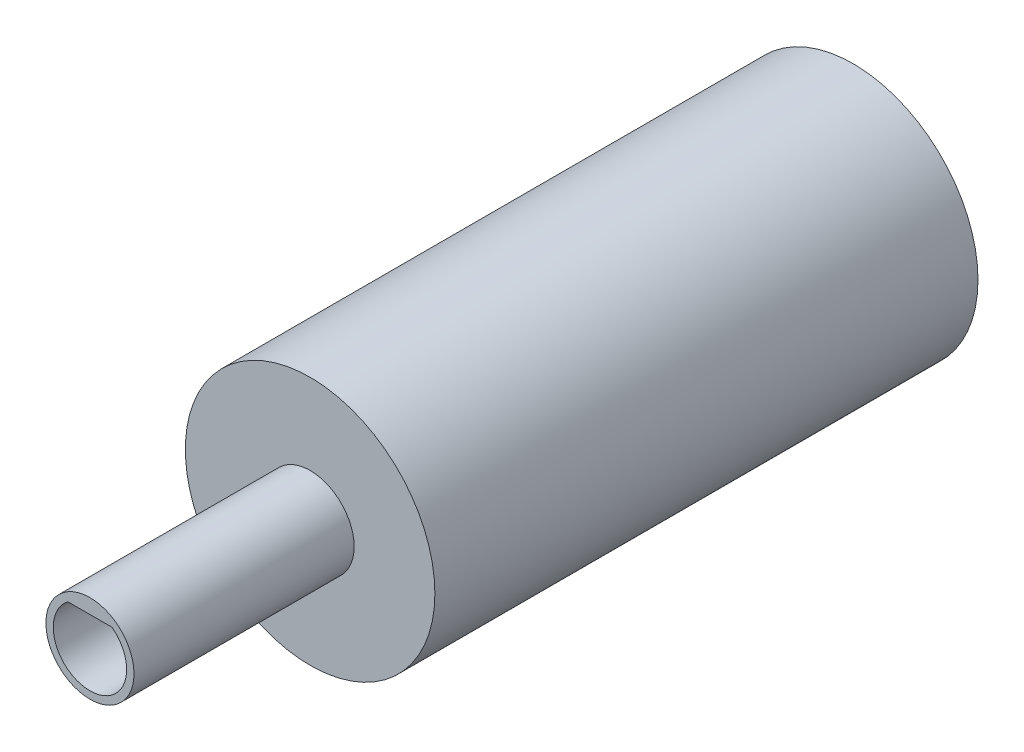
ISO-10303-21;
HEADER;
FILE_DESCRIPTION(('STEP AP214'),'2;1');
FILE_NAME('part.step','',(''),(''),'','','');
FILE_SCHEMA(('AUTOMOTIVE_DESIGN { 1 0 10303 214 1 1 1 1 }'));
ENDSEC;
DATA;
#1=APPLICATION_CONTEXT('core data for automotive mechanical design processes');
#2=APPLICATION_PROTOCOL_DEFINITION('international standard','automotive_design',2000,#1);
#3=PRODUCT_CONTEXT('',#1,'mechanical');
#4=PRODUCT('Part','Part','',(#3));
#5=PRODUCT_RELATED_PRODUCT_CATEGORY('part','',(#4));
#6=PRODUCT_DEFINITION_FORMATION('','',#4);
#7=PRODUCT_DEFINITION_CONTEXT('part definition',#1,'design');
#8=PRODUCT_DEFINITION('design','',#6,#7);
#9=PRODUCT_DEFINITION_SHAPE('','',#8);
#10=(LENGTH_UNIT() NAMED_UNIT(*) SI_UNIT(.MILLI.,.METRE.));
#11=(NAMED_UNIT(*) PLANE_ANGLE_UNIT() SI_UNIT($,.RADIAN.));
#12=(NAMED_UNIT(*) SI_UNIT($,.STERADIAN.) SOLID_ANGLE_UNIT());
#13=UNCERTAINTY_MEASURE_WITH_UNIT(LENGTH_MEASURE(1.E-05),#10,'distance_accuracy_value','');
#14=(GEOMETRIC_REPRESENTATION_CONTEXT(3) GLOBAL_UNCERTAINTY_ASSIGNED_CONTEXT((#13)) GLOBAL_UNIT_ASSIGNED_CONTEXT((#10,
#11,#12)) REPRESENTATION_CONTEXT('',''));
#15=CARTESIAN_POINT('',(0.,0.,0.));
#16=DIRECTION('',(0.,0.,1.));
#17=DIRECTION('',(1.,0.,0.));
#18=AXIS2_PLACEMENT_3D('',#15,#16,#17);
#19=CARTESIAN_POINT('',(0.,4.76175673143294,-5.25));
#20=DIRECTION('',(0.,-1.,0.));
#21=DIRECTION('',(0.,0.,-1.));
#22=AXIS2_PLACEMENT_3D('',#19,#20,#21);
#23=PLANE('',#22);
#24=DIRECTION('',(0.,0.,-1.));
#25=VECTOR('',#24,1.);
#26=CARTESIAN_POINT('',(-2.39,4.76175673143294,-5.25));
#27=LINE('',#26,#25);
#28=CARTESIAN_POINT('',(-2.39,4.76175673143294,-5.25));
#29=VERTEX_POINT('',#28);
#30=CARTESIAN_POINT('',(-2.39,4.76175673143294,-34.61));
#31=VERTEX_POINT('',#30);
#32=EDGE_CURVE('E124',#29,#31,#27,.T.);
#33=ORIENTED_EDGE('',*,*,#32,.T.);
#34=CARTESIAN_POINT('',(0.,4.76175673143294,-34.61));
#35=DIRECTION('',(0.,-1.,0.));
#36=DIRECTION('',(0.,0.,-1.));
#37=AXIS2_PLACEMENT_3D('',#34,#35,#36);
#38=CIRCLE('',#37,2.39);
#39=CARTESIAN_POINT('',(2.39,4.76175673143294,-34.61));
#40=VERTEX_POINT('',#39);
#41=EDGE_CURVE('E107',#31,#40,#38,.T.);
#42=ORIENTED_EDGE('',*,*,#41,.T.);
#43=DIRECTION('',(0.,0.,-1.));
#44=VECTOR('',#43,1.);
#45=CARTESIAN_POINT('',(2.39,4.76175673143294,-5.25));
#46=LINE('',#45,#44);
#47=CARTESIAN_POINT('',(2.39,4.76175673143294,-5.25));
#48=VERTEX_POINT('',#47);
#49=EDGE_CURVE('E132',#48,#40,#46,.T.);
#50=ORIENTED_EDGE('',*,*,#49,.F.);
#51=DIRECTION('',(-1.,0.,0.));
#52=VECTOR('',#51,1.);
#53=CARTESIAN_POINT('',(0.,4.76175673143294,-5.25));
#54=LINE('',#53,#52);
#55=EDGE_CURVE('E131',#48,#29,#54,.T.);
#56=ORIENTED_EDGE('',*,*,#55,.T.);
#57=EDGE_LOOP('',(#33,#42,#50,#56));
#58=FACE_BOUND('',#57,.T.);
#59=ADVANCED_FACE('F52',(#58),#23,.T.);
#60=CARTESIAN_POINT('',(-2.39,0.,-5.25));
#61=DIRECTION('',(-1.,0.,0.));
#62=DIRECTION('',(0.,-1.,0.));
#63=AXIS2_PLACEMENT_3D('',#60,#61,#62);
#64=PLANE('',#63);
#65=DIRECTION('',(0.,0.,-1.));
#66=VECTOR('',#65,1.);
#67=CARTESIAN_POINT('',(-2.39,7.57175673143294,-5.25));
#68=LINE('',#67,#66);
#69=CARTESIAN_POINT('',(-2.39,7.57175673143294,-5.25));
#70=VERTEX_POINT('',#69);
#71=CARTESIAN_POINT('',(-2.39,7.57175673143294,-34.61));
#72=VERTEX_POINT('',#71);
#73=EDGE_CURVE('E127',#70,#72,#68,.T.);
#74=ORIENTED_EDGE('',*,*,#73,.T.);
#75=DIRECTION('',(0.,-1.,0.));
#76=VECTOR('',#75,1.);
#77=CARTESIAN_POINT('',(-2.39,8.501,-34.61));
#78=LINE('',#77,#76);
#79=EDGE_CURVE('E111',#72,#31,#78,.T.);
#80=ORIENTED_EDGE('',*,*,#79,.T.);
#81=ORIENTED_EDGE('',*,*,#32,.F.);
#82=DIRECTION('',(0.,1.,0.));
#83=VECTOR('',#82,1.);
#84=CARTESIAN_POINT('',(-2.39,0.,-5.25));
#85=LINE('',#84,#83);
#86=EDGE_CURVE('E224',#29,#70,#85,.T.);
#87=ORIENTED_EDGE('',*,*,#86,.T.);
#88=EDGE_LOOP('',(#74,#80,#81,#87));
#89=FACE_BOUND('',#88,.T.);
#90=ADVANCED_FACE('F123',(#89),#64,.T.);
#91=CARTESIAN_POINT('',(0.,0.,-37.));
#92=DIRECTION('',(0.,0.,-1.));
#93=DIRECTION('',(-1.,0.,0.));
#94=AXIS2_PLACEMENT_3D('',#91,#92,#93);
#95=PLANE('',#94);
#96=CARTESIAN_POINT('',(0.,0.,-37.));
#97=DIRECTION('',(0.,0.,-1.));
#98=DIRECTION('',(-1.,0.,0.));
#99=AXIS2_PLACEMENT_3D('',#96,#97,#98);
#100=CIRCLE('',#99,7.94);
#101=CARTESIAN_POINT('',(0.,7.94,-37.));
#102=VERTEX_POINT('',#101);
#103=EDGE_CURVE('E119',#102,#102,#100,.T.);
#104=ORIENTED_EDGE('',*,*,#103,.F.);
#105=EDGE_LOOP('',(#104));
#106=FACE_BOUND('',#105,.T.);
#107=CARTESIAN_POINT('',(0.,0.,-37.));
#108=DIRECTION('',(0.,0.,-1.));
#109=DIRECTION('',(-1.,0.,0.));
#110=AXIS2_PLACEMENT_3D('',#107,#108,#109);
#111=CIRCLE('',#110,8.5);
#112=CARTESIAN_POINT('',(8.5,0.,-37.));
#113=VERTEX_POINT('',#112);
#114=EDGE_CURVE('E134',#113,#113,#111,.T.);
#115=ORIENTED_EDGE('',*,*,#114,.T.);
#116=EDGE_LOOP('',(#115));
#117=FACE_BOUND('',#116,.T.);
#118=ADVANCED_FACE('F168',(#106,#117),#95,.T.);
#119=CARTESIAN_POINT('',(0.,0.,15.));
#120=DIRECTION('',(0.,0.,1.));
#121=DIRECTION('',(1.,0.,0.));
#122=AXIS2_PLACEMENT_3D('',#119,#120,#121);
#123=PLANE('',#122);
#124=CARTESIAN_POINT('',(0.,0.,15.));
#125=DIRECTION('',(0.,0.,1.));
#126=DIRECTION('',(1.,0.,0.));
#127=AXIS2_PLACEMENT_3D('',#124,#125,#126);
#128=CIRCLE('',#127,3.);
#129=CARTESIAN_POINT('',(3.,0.,15.));
#130=VERTEX_POINT('',#129);
#131=EDGE_CURVE('E12',#130,#130,#128,.T.);
#132=ORIENTED_EDGE('',*,*,#131,.T.);
#133=EDGE_LOOP('',(#132));
#134=FACE_BOUND('',#133,.T.);
#135=DIRECTION('',(-1.,0.,0.));
#136=VECTOR('',#135,1.);
#137=CARTESIAN_POINT('',(1.5,2.,15.));
#138=LINE('',#137,#136);
#139=CARTESIAN_POINT('',(1.5,2.,15.));
#140=VERTEX_POINT('',#139);
#141=CARTESIAN_POINT('',(-1.5,2.,15.));
#142=VERTEX_POINT('',#141);
#143=EDGE_CURVE('E73',#140,#142,#138,.T.);
#144=ORIENTED_EDGE('',*,*,#143,.F.);
#145=CARTESIAN_POINT('',(0.,0.,15.));
#146=DIRECTION('',(0.,0.,1.));
#147=DIRECTION('',(1.,0.,0.));
#148=AXIS2_PLACEMENT_3D('',#145,#146,#147);
#149=CIRCLE('',#148,2.5);
#150=EDGE_CURVE('E147',#142,#140,#149,.T.);
#151=ORIENTED_EDGE('',*,*,#150,.F.);
#152=EDGE_LOOP('',(#144,#151));
#153=FACE_BOUND('',#152,.T.);
#154=ADVANCED_FACE('F166',(#134,#153),#123,.T.);
#155=CARTESIAN_POINT('',(0.,0.,15.));
#156=DIRECTION('',(0.,0.,-1.));
#157=DIRECTION('',(-1.,0.,0.));
#158=AXIS2_PLACEMENT_3D('',#155,#156,#157);
#159=CYLINDRICAL_SURFACE('',#158,3.);
#160=ORIENTED_EDGE('',*,*,#131,.F.);
#161=EDGE_LOOP('',(#160));
#162=FACE_BOUND('',#161,.T.);
#163=CARTESIAN_POINT('',(0.,0.,0.));
#164=DIRECTION('',(0.,0.,1.));
#165=DIRECTION('',(1.,0.,0.));
#166=AXIS2_PLACEMENT_3D('',#163,#164,#165);
#167=CIRCLE('',#166,3.);
#168=CARTESIAN_POINT('',(3.,0.,0.));
#169=VERTEX_POINT('',#168);
#170=EDGE_CURVE('E56',#169,#169,#167,.T.);
#171=ORIENTED_EDGE('',*,*,#170,.T.);
#172=EDGE_LOOP('',(#171));
#173=FACE_BOUND('',#172,.T.);
#174=ADVANCED_FACE('F54',(#162,#173),#159,.T.);
#175=CARTESIAN_POINT('',(0.,0.,15.));
#176=DIRECTION('',(0.,0.,-1.));
#177=DIRECTION('',(-1.,0.,0.));
#178=AXIS2_PLACEMENT_3D('',#175,#176,#177);
#179=CYLINDRICAL_SURFACE('',#178,2.5);
#180=CARTESIAN_POINT('',(0.,0.,0.));
#181=DIRECTION('',(0.,0.,1.));
#182=DIRECTION('',(1.,0.,0.));
#183=AXIS2_PLACEMENT_3D('',#180,#181,#182);
#184=CIRCLE('',#183,2.5);
#185=CARTESIAN_POINT('',(-1.5,2.,0.));
#186=VERTEX_POINT('',#185);
#187=CARTESIAN_POINT('',(1.5,2.,0.));
#188=VERTEX_POINT('',#187);
#189=EDGE_CURVE('E152',#186,#188,#184,.T.);
#190=ORIENTED_EDGE('',*,*,#189,.F.);
#191=DIRECTION('',(0.,0.,-1.));
#192=VECTOR('',#191,1.);
#193=CARTESIAN_POINT('',(-1.5,2.,15.));
#194=LINE('',#193,#192);
#195=EDGE_CURVE('E151',#142,#186,#194,.T.);
#196=ORIENTED_EDGE('',*,*,#195,.F.);
#197=ORIENTED_EDGE('',*,*,#150,.T.);
#198=DIRECTION('',(0.,0.,-1.));
#199=VECTOR('',#198,1.);
#200=CARTESIAN_POINT('',(1.5,2.,15.));
#201=LINE('',#200,#199);
#202=EDGE_CURVE('E61',#140,#188,#201,.T.);
#203=ORIENTED_EDGE('',*,*,#202,.T.);
#204=EDGE_LOOP('',(#190,#196,#197,#203));
#205=FACE_BOUND('',#204,.T.);
#206=ADVANCED_FACE('F160',(#205),#179,.F.);
#207=CARTESIAN_POINT('',(1.5,2.,15.));
#208=DIRECTION('',(0.,-1.,0.));
#209=DIRECTION('',(0.,0.,-1.));
#210=AXIS2_PLACEMENT_3D('',#207,#208,#209);
#211=PLANE('',#210);
#212=DIRECTION('',(-1.,0.,0.));
#213=VECTOR('',#212,1.);
#214=CARTESIAN_POINT('',(1.5,2.,0.));
#215=LINE('',#214,#213);
#216=EDGE_CURVE('E149',#188,#186,#215,.T.);
#217=ORIENTED_EDGE('',*,*,#216,.F.);
#218=ORIENTED_EDGE('',*,*,#202,.F.);
#219=ORIENTED_EDGE('',*,*,#143,.T.);
#220=ORIENTED_EDGE('',*,*,#195,.T.);
#221=EDGE_LOOP('',(#217,#218,#219,#220));
#222=FACE_BOUND('',#221,.T.);
#223=ADVANCED_FACE('F164',(#222),#211,.T.);
#224=CARTESIAN_POINT('',(0.,0.,0.));
#225=DIRECTION('',(0.,0.,-1.));
#226=DIRECTION('',(-1.,0.,0.));
#227=AXIS2_PLACEMENT_3D('',#224,#225,#226);
#228=PLANE('',#227);
#229=ORIENTED_EDGE('',*,*,#216,.T.);
#230=ORIENTED_EDGE('',*,*,#189,.T.);
#231=EDGE_LOOP('',(#229,#230));
#232=FACE_BOUND('',#231,.T.);
#233=ADVANCED_FACE('F163',(#232),#228,.F.);
#234=CARTESIAN_POINT('',(0.,0.,-5.25));
#235=DIRECTION('',(0.,0.,1.));
#236=DIRECTION('',(1.,0.,0.));
#237=AXIS2_PLACEMENT_3D('',#234,#235,#236);
#238=CYLINDRICAL_SURFACE('',#237,8.5);
#239=CARTESIAN_POINT('',(0.,0.,0.));
#240=DIRECTION('',(0.,0.,-1.));
#241=DIRECTION('',(-1.,0.,0.));
#242=AXIS2_PLACEMENT_3D('',#239,#240,#241);
#243=CIRCLE('',#242,8.5);
#244=CARTESIAN_POINT('',(8.5,0.,0.));
#245=VERTEX_POINT('',#244);
#246=EDGE_CURVE('E144',#245,#245,#243,.T.);
#247=CARTESIAN_POINT('',(8.5,0.,0.));
#248=CARTESIAN_POINT('',(8.5,0.,-0.385416666666667));
#249=CARTESIAN_POINT('',(8.5,0.,-0.770833333333333));
#250=CARTESIAN_POINT('',(8.5,0.,-1.54166666666667));
#251=CARTESIAN_POINT('',(8.5,0.,-1.92708333333333));
#252=CARTESIAN_POINT('',(8.5,0.,-2.69791666666667));
#253=CARTESIAN_POINT('',(8.5,0.,-3.08333333333333));
#254=CARTESIAN_POINT('',(8.5,0.,-3.85416666666667));
#255=CARTESIAN_POINT('',(8.5,0.,-4.23958333333333));
#256=CARTESIAN_POINT('',(8.5,0.,-5.01041666666667));
#257=CARTESIAN_POINT('',(8.5,0.,-5.39583333333333));
#258=CARTESIAN_POINT('',(8.5,0.,-6.16666666666667));
#259=CARTESIAN_POINT('',(8.5,0.,-6.55208333333333));
#260=CARTESIAN_POINT('',(8.5,0.,-7.32291666666667));
#261=CARTESIAN_POINT('',(8.5,0.,-7.70833333333333));
#262=CARTESIAN_POINT('',(8.5,0.,-8.47916666666667));
#263=CARTESIAN_POINT('',(8.5,0.,-8.86458333333333));
#264=CARTESIAN_POINT('',(8.5,0.,-9.63541666666667));
#265=CARTESIAN_POINT('',(8.5,0.,-10.0208333333333));
#266=CARTESIAN_POINT('',(8.5,0.,-10.7916666666667));
#267=CARTESIAN_POINT('',(8.5,0.,-11.1770833333333));
#268=CARTESIAN_POINT('',(8.5,0.,-11.9479166666667));
#269=CARTESIAN_POINT('',(8.5,0.,-12.3333333333333));
#270=CARTESIAN_POINT('',(8.5,0.,-13.1041666666667));
#271=CARTESIAN_POINT('',(8.5,0.,-13.4895833333333));
#272=CARTESIAN_POINT('',(8.5,0.,-14.2604166666667));
#273=CARTESIAN_POINT('',(8.5,0.,-14.6458333333333));
#274=CARTESIAN_POINT('',(8.5,0.,-15.4166666666667));
#275=CARTESIAN_POINT('',(8.5,0.,-15.8020833333333));
#276=CARTESIAN_POINT('',(8.5,0.,-16.5729166666667));
#277=CARTESIAN_POINT('',(8.5,0.,-16.9583333333333));
#278=CARTESIAN_POINT('',(8.5,0.,-17.7291666666667));
#279=CARTESIAN_POINT('',(8.5,0.,-18.1145833333333));
#280=CARTESIAN_POINT('',(8.5,0.,-18.8854166666667));
#281=CARTESIAN_POINT('',(8.5,0.,-19.2708333333333));
#282=CARTESIAN_POINT('',(8.5,0.,-20.0416666666667));
#283=CARTESIAN_POINT('',(8.5,0.,-20.4270833333333));
#284=CARTESIAN_POINT('',(8.5,0.,-21.1979166666667));
#285=CARTESIAN_POINT('',(8.5,0.,-21.5833333333333));
#286=CARTESIAN_POINT('',(8.5,0.,-22.3541666666667));
#287=CARTESIAN_POINT('',(8.5,0.,-22.7395833333333));
#288=CARTESIAN_POINT('',(8.5,0.,-23.5104166666667));
#289=CARTESIAN_POINT('',(8.5,0.,-23.8958333333333));
#290=CARTESIAN_POINT('',(8.5,0.,-24.6666666666667));
#291=CARTESIAN_POINT('',(8.5,0.,-25.0520833333333));
#292=CARTESIAN_POINT('',(8.5,0.,-25.8229166666667));
#293=CARTESIAN_POINT('',(8.5,0.,-26.2083333333333));
#294=CARTESIAN_POINT('',(8.5,0.,-26.9791666666667));
#295=CARTESIAN_POINT('',(8.5,0.,-27.3645833333333));
#296=CARTESIAN_POINT('',(8.5,0.,-28.1354166666667));
#297=CARTESIAN_POINT('',(8.5,0.,-28.5208333333333));
#298=CARTESIAN_POINT('',(8.5,0.,-29.2916666666667));
#299=CARTESIAN_POINT('',(8.5,0.,-29.6770833333333));
#300=CARTESIAN_POINT('',(8.5,0.,-30.4479166666667));
#301=CARTESIAN_POINT('',(8.5,0.,-30.8333333333333));
#302=CARTESIAN_POINT('',(8.5,0.,-31.6041666666667));
#303=CARTESIAN_POINT('',(8.5,0.,-31.9895833333333));
#304=CARTESIAN_POINT('',(8.5,0.,-32.7604166666667));
#305=CARTESIAN_POINT('',(8.5,0.,-33.1458333333333));
#306=CARTESIAN_POINT('',(8.5,0.,-33.9166666666667));
#307=CARTESIAN_POINT('',(8.5,0.,-34.3020833333333));
#308=CARTESIAN_POINT('',(8.5,0.,-35.0729166666667));
#309=CARTESIAN_POINT('',(8.5,0.,-35.4583333333333));
#310=CARTESIAN_POINT('',(8.5,0.,-36.2291666666667));
#311=CARTESIAN_POINT('',(8.5,0.,-36.6145833333333));
#312=CARTESIAN_POINT('',(8.5,0.,-37.));
#313=B_SPLINE_CURVE_WITH_KNOTS('',3,(#247,#248,#249,#250,#251,#252,#253,#254,#255,#256,#257,
#258,#259,#260,#261,#262,#263,#264,#265,#266,#267,#268,#269,#270,#271,#272,#273,#274,#275,#276,
#277,#278,#279,#280,#281,#282,#283,#284,#285,#286,#287,#288,#289,#290,#291,#292,#293,#294,#295,
#296,#297,#298,#299,#300,#301,#302,#303,#304,#305,#306,#307,#308,#309,#310,#311,#312),
.UNSPECIFIED.,.F.,.F.,(4,2,2,2,2,2,2,2,2,2,2,2,2,2,2,2,2,2,2,2,2,2,2,2,2,2,2,2,2,2,2,2,4),(0.,
1.15625,2.3125,3.46875,4.625,5.78125,6.9375,8.09375,9.25,10.40625,11.5625,12.71875,13.875,
15.03125,16.1875,17.34375,18.5,19.65625,20.8125,21.96875,23.125,24.28125,25.4375,26.59375,27.75,
28.90625,30.0625,31.21875,32.375,33.53125,34.6875,35.84375,37.),.UNSPECIFIED.);
#314=EDGE_CURVE('BSEAM234',#245,#113,#313,.T.);
#315=ORIENTED_EDGE('',*,*,#246,.T.);
#316=ORIENTED_EDGE('',*,*,#114,.F.);
#317=ORIENTED_EDGE('',*,*,#314,.T.);
#318=ORIENTED_EDGE('',*,*,#314,.F.);
#319=EDGE_LOOP('',(#315,#317,#316,#318));
#320=FACE_BOUND('',#319,.T.);
#321=ADVANCED_FACE('F234',(#320),#238,.T.);
#322=ORIENTED_EDGE('',*,*,#170,.F.);
#323=EDGE_LOOP('',(#322));
#324=FACE_BOUND('',#323,.T.);
#325=ORIENTED_EDGE('',*,*,#246,.F.);
#326=EDGE_LOOP('',(#325));
#327=FACE_BOUND('',#326,.T.);
#328=ADVANCED_FACE('F230',(#324,#327),#228,.F.);
#329=CARTESIAN_POINT('',(2.39,0.,-5.25));
#330=DIRECTION('',(1.,0.,0.));
#331=DIRECTION('',(0.,1.,0.));
#332=AXIS2_PLACEMENT_3D('',#329,#330,#331);
#333=PLANE('',#332);
#334=DIRECTION('',(0.,-1.,0.));
#335=VECTOR('',#334,1.);
#336=CARTESIAN_POINT('',(2.39,8.501,-34.61));
#337=LINE('',#336,#335);
#338=CARTESIAN_POINT('',(2.39,7.57175673143294,-34.61));
#339=VERTEX_POINT('',#338);
#340=EDGE_CURVE('E114',#339,#40,#337,.T.);
#341=ORIENTED_EDGE('',*,*,#340,.F.);
#342=DIRECTION('',(0.,0.,-1.));
#343=VECTOR('',#342,1.);
#344=CARTESIAN_POINT('',(2.39,7.57175673143294,-5.25));
#345=LINE('',#344,#343);
#346=CARTESIAN_POINT('',(2.39,7.57175673143294,-5.25));
#347=VERTEX_POINT('',#346);
#348=EDGE_CURVE('E136',#347,#339,#345,.T.);
#349=ORIENTED_EDGE('',*,*,#348,.F.);
#350=DIRECTION('',(0.,-1.,0.));
#351=VECTOR('',#350,1.);
#352=CARTESIAN_POINT('',(2.39,0.,-5.25));
#353=LINE('',#352,#351);
#354=EDGE_CURVE('E218',#347,#48,#353,.T.);
#355=ORIENTED_EDGE('',*,*,#354,.T.);
#356=ORIENTED_EDGE('',*,*,#49,.T.);
#357=EDGE_LOOP('',(#341,#349,#355,#356));
#358=FACE_BOUND('',#357,.T.);
#359=ADVANCED_FACE('F192',(#358),#333,.T.);
#360=CARTESIAN_POINT('',(0.,0.,-5.25));
#361=DIRECTION('',(0.,0.,-1.));
#362=DIRECTION('',(-1.,0.,0.));
#363=AXIS2_PLACEMENT_3D('',#360,#361,#362);
#364=CYLINDRICAL_SURFACE('',#363,7.94);
#365=ORIENTED_EDGE('',*,*,#103,.T.);
#366=CARTESIAN_POINT('',(-2.39,7.57175673143294,-34.61));
#367=CARTESIAN_POINT('',(-2.39000820216147,7.57174755390499,-34.6755851304432));
#368=CARTESIAN_POINT('',(-2.38730052794319,7.57260864939615,-34.7411649992244));
#369=CARTESIAN_POINT('',(-2.37651723780347,7.57600317819314,-34.8718239313435));
#370=CARTESIAN_POINT('',(-2.36844283623438,7.57853623317665,-34.9369031046067));
#371=CARTESIAN_POINT('',(-2.34701784702367,7.58519782478595,-35.0659318517927));
#372=CARTESIAN_POINT('',(-2.33368108603094,7.58932217970735,-35.1298839307625));
#373=CARTESIAN_POINT('',(-2.30186248424348,7.59903309040221,-35.2563646741237));
#374=CARTESIAN_POINT('',(-2.28338050777619,7.60461968473277,-35.3188933009334));
#375=CARTESIAN_POINT('',(-2.2204434016848,7.62333070283431,-35.5036537165895));
#376=CARTESIAN_POINT('',(-2.16846981909439,7.63841538699198,-35.6232225265568));
#377=CARTESIAN_POINT('',(-2.04610078765806,7.67209716405225,-35.8519481184016));
#378=CARTESIAN_POINT('',(-1.97569607377416,7.6906960221624,-35.961099625903));
#379=CARTESIAN_POINT('',(-1.8160679222923,7.72996967012936,-36.1693881102175));
#380=CARTESIAN_POINT('',(-1.72636306005919,7.75068867303062,-36.2681485129156));
#381=CARTESIAN_POINT('',(-1.53170555356776,7.7914922850749,-36.4494776693679));
#382=CARTESIAN_POINT('',(-1.42674993918975,7.81157676971428,-36.5320432617677));
#383=CARTESIAN_POINT('',(-1.20184930443644,7.84935778235983,-36.6803086579559));
#384=CARTESIAN_POINT('',(-1.08163439830951,7.86699487949292,-36.7456151856967));
#385=CARTESIAN_POINT('',(-0.831343931280943,7.8973609267161,-36.8549000765373));
#386=CARTESIAN_POINT('',(-0.70127704750006,7.9100941371097,-36.8988969612162));
#387=CARTESIAN_POINT('',(-0.475485769971521,7.92629603032931,-36.9541729336318));
#388=CARTESIAN_POINT('',(-0.381275189930803,7.93140208145,-36.9713232315992));
#389=CARTESIAN_POINT('',(-0.191395117498627,7.93826863504613,-36.9942482514085));
#390=CARTESIAN_POINT('',(-0.0957261306976931,7.94003027149816,-37.0000268290361));
#391=CARTESIAN_POINT('',(0.,7.94,-37.));
#392=B_SPLINE_CURVE_WITH_KNOTS('',3,(#366,#367,#368,#369,#370,#371,#372,#373,#374,#375,#376,
#377,#378,#379,#380,#381,#382,#383,#384,#385,#386,#387,#388,#389,#390,#391),.UNSPECIFIED.,.F.,
.F.,(4,2,2,2,2,2,2,2,2,2,2,2,4),(0.,0.196684911196479,0.393325332801097,0.589452493340342,
0.785584825984681,1.17736069390389,1.5693338807806,1.97253863651889,2.37582202283598,
2.78762754600999,3.19907449737646,3.48605425422834,3.77293668867184),.UNSPECIFIED.);
#393=EDGE_CURVE('E129',#72,#102,#392,.T.);
#394=ORIENTED_EDGE('',*,*,#393,.F.);
#395=ORIENTED_EDGE('',*,*,#73,.F.);
#396=CARTESIAN_POINT('',(0.,0.,-5.25));
#397=DIRECTION('',(0.,0.,-1.));
#398=DIRECTION('',(-1.,0.,0.));
#399=AXIS2_PLACEMENT_3D('',#396,#397,#398);
#400=CIRCLE('',#399,7.94);
#401=EDGE_CURVE('E220',#347,#70,#400,.T.);
#402=ORIENTED_EDGE('',*,*,#401,.F.);
#403=ORIENTED_EDGE('',*,*,#348,.T.);
#404=CARTESIAN_POINT('',(0.,7.94,-37.));
#405=CARTESIAN_POINT('',(0.0656532720791321,7.9400076761902,-37.0000080420145));
#406=CARTESIAN_POINT('',(0.131301668317896,7.93918587955241,-36.9972949000759));
#407=CARTESIAN_POINT('',(0.262101584704225,7.93594038430744,-36.9864886681208));
#408=CARTESIAN_POINT('',(0.327253201300203,7.9335170050893,-36.9783966507625));
#409=CARTESIAN_POINT('',(0.456440636111504,7.92713317121287,-36.9569213654975));
#410=CARTESIAN_POINT('',(0.520478795785613,7.9231764946518,-36.9435511018665));
#411=CARTESIAN_POINT('',(0.647132965921687,7.91383972603715,-36.9116493009381));
#412=CARTESIAN_POINT('',(0.709748948269412,7.90845960587084,-36.8931176617041));
#413=CARTESIAN_POINT('',(0.894784531614033,7.89038972598337,-36.8300005239535));
#414=CARTESIAN_POINT('',(1.01453855480259,7.87576271609132,-36.7778681466102));
#415=CARTESIAN_POINT('',(1.24357306899574,7.84286737502387,-36.6551274533441));
#416=CARTESIAN_POINT('',(1.35284908137787,7.82459749695906,-36.5845112845585));
#417=CARTESIAN_POINT('',(1.56101030783775,7.78577824131361,-36.4246619876461));
#418=CARTESIAN_POINT('',(1.65955440536208,7.76518218917552,-36.3349952709717));
#419=CARTESIAN_POINT('',(1.84046276599969,7.72430714559174,-36.1405046604913));
#420=CARTESIAN_POINT('',(1.92282278447105,7.70402823860472,-36.0356768028136));
#421=CARTESIAN_POINT('',(2.07085599866974,7.66558247835159,-35.8109063450644));
#422=CARTESIAN_POINT('',(2.13610243307394,7.64747484004195,-35.6906718636285));
#423=CARTESIAN_POINT('',(2.24526827855997,7.61614172507845,-35.4403463850536));
#424=CARTESIAN_POINT('',(2.28920783172382,7.60291164036388,-35.3102648317193));
#425=CARTESIAN_POINT('',(2.34433878062577,7.58605612942587,-35.084627134398));
#426=CARTESIAN_POINT('',(2.36142498517425,7.58073353610092,-34.9905975233221));
#427=CARTESIAN_POINT('',(2.38426801784155,7.57356611666526,-34.8010648845564));
#428=CARTESIAN_POINT('',(2.39002724321322,7.57172055467575,-34.7055621729481));
#429=CARTESIAN_POINT('',(2.39,7.57175673143294,-34.61));
#430=B_SPLINE_CURVE_WITH_KNOTS('',3,(#404,#405,#406,#407,#408,#409,#410,#411,#412,#413,#414,
#415,#416,#417,#418,#419,#420,#421,#422,#423,#424,#425,#426,#427,#428,#429),.UNSPECIFIED.,.F.,
.F.,(4,2,2,2,2,2,2,2,2,2,2,2,4),(0.,0.1968902887829,0.393741325370784,0.590110367177456,
0.786483287522703,1.17878762341532,1.57125890160732,1.97386317233013,2.37657289463592,
2.78853305869744,3.20010302062276,3.4865497988856,3.7729359467479),.UNSPECIFIED.);
#431=EDGE_CURVE('E128',#102,#339,#430,.T.);
#432=ORIENTED_EDGE('',*,*,#431,.F.);
#433=EDGE_LOOP('',(#365,#394,#395,#402,#403,#432));
#434=FACE_BOUND('',#433,.T.);
#435=ADVANCED_FACE('F188',(#434),#364,.F.);
#436=CARTESIAN_POINT('',(0.,0.,-5.25));
#437=DIRECTION('',(0.,0.,-1.));
#438=DIRECTION('',(-1.,0.,0.));
#439=AXIS2_PLACEMENT_3D('',#436,#437,#438);
#440=PLANE('',#439);
#441=ORIENTED_EDGE('',*,*,#354,.F.);
#442=ORIENTED_EDGE('',*,*,#401,.T.);
#443=ORIENTED_EDGE('',*,*,#86,.F.);
#444=ORIENTED_EDGE('',*,*,#55,.F.);
#445=EDGE_LOOP('',(#441,#442,#443,#444));
#446=FACE_BOUND('',#445,.T.);
#447=ADVANCED_FACE('F185',(#446),#440,.T.);
#448=CARTESIAN_POINT('',(0.,8.501,-34.61));
#449=DIRECTION('',(0.,-1.,0.));
#450=DIRECTION('',(0.,0.,-1.));
#451=AXIS2_PLACEMENT_3D('',#448,#449,#450);
#452=CYLINDRICAL_SURFACE('',#451,2.39);
#453=ORIENTED_EDGE('',*,*,#431,.T.);
#454=ORIENTED_EDGE('',*,*,#340,.T.);
#455=ORIENTED_EDGE('',*,*,#41,.F.);
#456=ORIENTED_EDGE('',*,*,#79,.F.);
#457=ORIENTED_EDGE('',*,*,#393,.T.);
#458=EDGE_LOOP('',(#453,#454,#455,#456,#457));
#459=FACE_BOUND('',#458,.T.);
#460=ADVANCED_FACE('F109',(#459),#452,.T.);
#461=CLOSED_SHELL('',(#59,#90,#118,#154,#174,#206,#223,#233,#321,#328,#359,#435,#447,#460));
#462=MANIFOLD_SOLID_BREP('B2',#461);
#463=ADVANCED_BREP_SHAPE_REPRESENTATION('',(#18,#462),#14);
#464=SHAPE_DEFINITION_REPRESENTATION(#9,#463);
ENDSEC;
END-ISO-10303-21;
